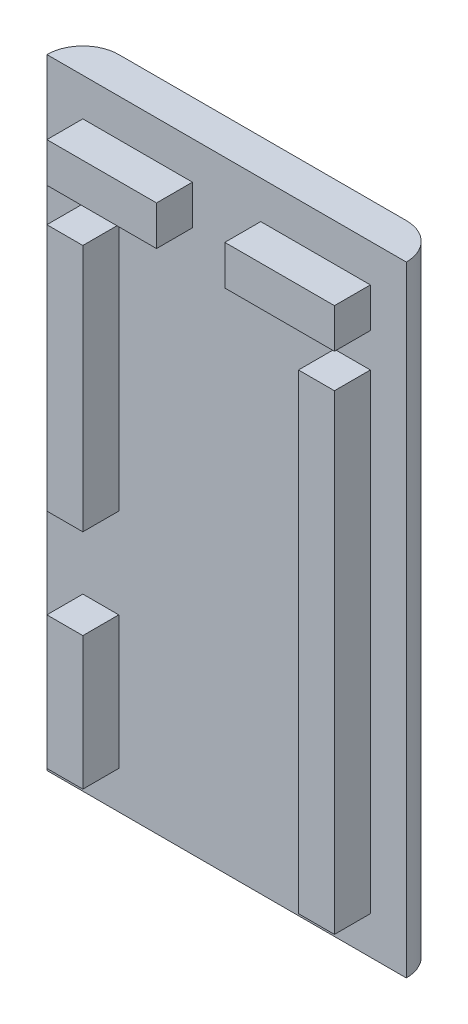
ISO-10303-21;
HEADER;
FILE_DESCRIPTION(('STEP AP214'),'2;1');
FILE_NAME('part.step','',(''),(''),'','','');
FILE_SCHEMA(('AUTOMOTIVE_DESIGN { 1 0 10303 214 1 1 1 1 }'));
ENDSEC;
DATA;
#1=APPLICATION_CONTEXT('core data for automotive mechanical design processes');
#2=APPLICATION_PROTOCOL_DEFINITION('international standard','automotive_design',2000,#1);
#3=PRODUCT_CONTEXT('',#1,'mechanical');
#4=PRODUCT('Part','Part','',(#3));
#5=PRODUCT_RELATED_PRODUCT_CATEGORY('part','',(#4));
#6=PRODUCT_DEFINITION_FORMATION('','',#4);
#7=PRODUCT_DEFINITION_CONTEXT('part definition',#1,'design');
#8=PRODUCT_DEFINITION('design','',#6,#7);
#9=PRODUCT_DEFINITION_SHAPE('','',#8);
#10=(LENGTH_UNIT() NAMED_UNIT(*) SI_UNIT(.MILLI.,.METRE.));
#11=(NAMED_UNIT(*) PLANE_ANGLE_UNIT() SI_UNIT($,.RADIAN.));
#12=(NAMED_UNIT(*) SI_UNIT($,.STERADIAN.) SOLID_ANGLE_UNIT());
#13=UNCERTAINTY_MEASURE_WITH_UNIT(LENGTH_MEASURE(1.E-05),#10,'distance_accuracy_value','');
#14=(GEOMETRIC_REPRESENTATION_CONTEXT(3) GLOBAL_UNCERTAINTY_ASSIGNED_CONTEXT((#13)) GLOBAL_UNIT_ASSIGNED_CONTEXT((#10,
#11,#12)) REPRESENTATION_CONTEXT('',''));
#15=CARTESIAN_POINT('',(0.,0.,0.));
#16=DIRECTION('',(0.,0.,1.));
#17=DIRECTION('',(1.,0.,0.));
#18=AXIS2_PLACEMENT_3D('',#15,#16,#17);
#19=CARTESIAN_POINT('',(-8.,12.95,4.));
#20=DIRECTION('',(0.,1.,0.));
#21=DIRECTION('',(0.,0.,1.));
#22=AXIS2_PLACEMENT_3D('',#19,#20,#21);
#23=PLANE('',#22);
#24=DIRECTION('',(0.,0.,-1.));
#25=VECTOR('',#24,1.);
#26=CARTESIAN_POINT('',(-1.9,12.95,4.));
#27=LINE('',#26,#25);
#28=CARTESIAN_POINT('',(-1.9,12.95,4.));
#29=VERTEX_POINT('',#28);
#30=CARTESIAN_POINT('',(-1.9,12.95,2.));
#31=VERTEX_POINT('',#30);
#32=EDGE_CURVE('E216',#29,#31,#27,.T.);
#33=ORIENTED_EDGE('',*,*,#32,.F.);
#34=DIRECTION('',(1.,0.,0.));
#35=VECTOR('',#34,1.);
#36=CARTESIAN_POINT('',(-8.,12.95,4.));
#37=LINE('',#36,#35);
#38=CARTESIAN_POINT('',(-8.,12.95,4.));
#39=VERTEX_POINT('',#38);
#40=EDGE_CURVE('E249',#39,#29,#37,.T.);
#41=ORIENTED_EDGE('',*,*,#40,.F.);
#42=DIRECTION('',(0.,0.,-1.));
#43=VECTOR('',#42,1.);
#44=CARTESIAN_POINT('',(-8.,12.95,4.));
#45=LINE('',#44,#43);
#46=CARTESIAN_POINT('',(-8.,12.95,2.));
#47=VERTEX_POINT('',#46);
#48=EDGE_CURVE('E226',#39,#47,#45,.T.);
#49=ORIENTED_EDGE('',*,*,#48,.T.);
#50=DIRECTION('',(1.,0.,0.));
#51=VECTOR('',#50,1.);
#52=CARTESIAN_POINT('',(-8.,12.95,2.));
#53=LINE('',#52,#51);
#54=EDGE_CURVE('E213',#47,#31,#53,.T.);
#55=ORIENTED_EDGE('',*,*,#54,.T.);
#56=EDGE_LOOP('',(#33,#41,#49,#55));
#57=FACE_BOUND('',#56,.T.);
#58=ADVANCED_FACE('F44',(#57),#23,.F.);
#59=CARTESIAN_POINT('',(-8.,15.15,4.));
#60=DIRECTION('',(0.,-1.,0.));
#61=DIRECTION('',(0.,0.,-1.));
#62=AXIS2_PLACEMENT_3D('',#59,#60,#61);
#63=PLANE('',#62);
#64=DIRECTION('',(0.,0.,1.));
#65=VECTOR('',#64,1.);
#66=CARTESIAN_POINT('',(-1.9,15.15,4.));
#67=LINE('',#66,#65);
#68=CARTESIAN_POINT('',(-1.9,15.15,2.));
#69=VERTEX_POINT('',#68);
#70=CARTESIAN_POINT('',(-1.9,15.15,4.));
#71=VERTEX_POINT('',#70);
#72=EDGE_CURVE('E60',#69,#71,#67,.T.);
#73=ORIENTED_EDGE('',*,*,#72,.F.);
#74=DIRECTION('',(-1.,0.,0.));
#75=VECTOR('',#74,1.);
#76=CARTESIAN_POINT('',(-8.,15.15,2.));
#77=LINE('',#76,#75);
#78=CARTESIAN_POINT('',(-8.,15.15,2.));
#79=VERTEX_POINT('',#78);
#80=EDGE_CURVE('E214',#69,#79,#77,.T.);
#81=ORIENTED_EDGE('',*,*,#80,.T.);
#82=DIRECTION('',(0.,0.,-1.));
#83=VECTOR('',#82,1.);
#84=CARTESIAN_POINT('',(-8.,15.15,4.));
#85=LINE('',#84,#83);
#86=CARTESIAN_POINT('',(-8.,15.15,4.));
#87=VERTEX_POINT('',#86);
#88=EDGE_CURVE('E441',#87,#79,#85,.T.);
#89=ORIENTED_EDGE('',*,*,#88,.F.);
#90=DIRECTION('',(-1.,0.,0.));
#91=VECTOR('',#90,1.);
#92=CARTESIAN_POINT('',(-8.,15.15,4.));
#93=LINE('',#92,#91);
#94=EDGE_CURVE('E245',#71,#87,#93,.T.);
#95=ORIENTED_EDGE('',*,*,#94,.F.);
#96=EDGE_LOOP('',(#73,#81,#89,#95));
#97=FACE_BOUND('',#96,.T.);
#98=ADVANCED_FACE('F403',(#97),#63,.F.);
#99=CARTESIAN_POINT('',(0.,0.,4.));
#100=DIRECTION('',(0.,0.,1.));
#101=DIRECTION('',(1.,0.,0.));
#102=AXIS2_PLACEMENT_3D('',#99,#100,#101);
#103=PLANE('',#102);
#104=ORIENTED_EDGE('',*,*,#40,.T.);
#105=DIRECTION('',(0.,-1.,0.));
#106=VECTOR('',#105,1.);
#107=CARTESIAN_POINT('',(-1.9,12.95,4.));
#108=LINE('',#107,#106);
#109=EDGE_CURVE('E220',#71,#29,#108,.T.);
#110=ORIENTED_EDGE('',*,*,#109,.F.);
#111=ORIENTED_EDGE('',*,*,#94,.T.);
#112=DIRECTION('',(0.,-1.,0.));
#113=VECTOR('',#112,1.);
#114=CARTESIAN_POINT('',(-8.,15.15,4.));
#115=LINE('',#114,#113);
#116=EDGE_CURVE('E252',#87,#39,#115,.T.);
#117=ORIENTED_EDGE('',*,*,#116,.T.);
#118=EDGE_LOOP('',(#104,#110,#111,#117));
#119=FACE_BOUND('',#118,.T.);
#120=ADVANCED_FACE('F410',(#119),#103,.T.);
#121=CARTESIAN_POINT('',(0.,0.,2.));
#122=DIRECTION('',(0.,0.,1.));
#123=DIRECTION('',(1.,0.,0.));
#124=AXIS2_PLACEMENT_3D('',#121,#122,#123);
#125=PLANE('',#124);
#126=DIRECTION('',(0.,1.,0.));
#127=VECTOR('',#126,1.);
#128=CARTESIAN_POINT('',(-1.9,12.95,2.));
#129=LINE('',#128,#127);
#130=EDGE_CURVE('E207',#31,#69,#129,.T.);
#131=ORIENTED_EDGE('',*,*,#130,.F.);
#132=ORIENTED_EDGE('',*,*,#54,.F.);
#133=DIRECTION('',(0.,-1.,0.));
#134=VECTOR('',#133,1.);
#135=CARTESIAN_POINT('',(-8.,15.15,2.));
#136=LINE('',#135,#134);
#137=EDGE_CURVE('E229',#79,#47,#136,.T.);
#138=ORIENTED_EDGE('',*,*,#137,.F.);
#139=ORIENTED_EDGE('',*,*,#80,.F.);
#140=EDGE_LOOP('',(#131,#132,#138,#139));
#141=FACE_BOUND('',#140,.T.);
#142=DIRECTION('',(-1.,0.,0.));
#143=VECTOR('',#142,1.);
#144=CARTESIAN_POINT('',(-10.,17.25,2.));
#145=LINE('',#144,#143);
#146=CARTESIAN_POINT('',(10.,17.25,2.));
#147=VERTEX_POINT('',#146);
#148=CARTESIAN_POINT('',(-10.,17.25,2.));
#149=VERTEX_POINT('',#148);
#150=EDGE_CURVE('E339',#147,#149,#145,.T.);
#151=ORIENTED_EDGE('',*,*,#150,.T.);
#152=DIRECTION('',(0.,-1.,0.));
#153=VECTOR('',#152,1.);
#154=CARTESIAN_POINT('',(-10.,-17.25,2.));
#155=LINE('',#154,#153);
#156=CARTESIAN_POINT('',(-10.,-17.25,2.));
#157=VERTEX_POINT('',#156);
#158=EDGE_CURVE('E343',#149,#157,#155,.T.);
#159=ORIENTED_EDGE('',*,*,#158,.T.);
#160=DIRECTION('',(1.,0.,0.));
#161=VECTOR('',#160,1.);
#162=CARTESIAN_POINT('',(-10.,-17.25,2.));
#163=LINE('',#162,#161);
#164=CARTESIAN_POINT('',(10.,-17.25,2.));
#165=VERTEX_POINT('',#164);
#166=EDGE_CURVE('E348',#157,#165,#163,.T.);
#167=ORIENTED_EDGE('',*,*,#166,.T.);
#168=DIRECTION('',(0.,1.,0.));
#169=VECTOR('',#168,1.);
#170=CARTESIAN_POINT('',(10.,-17.25,2.));
#171=LINE('',#170,#169);
#172=EDGE_CURVE('E352',#165,#147,#171,.T.);
#173=ORIENTED_EDGE('',*,*,#172,.T.);
#174=EDGE_LOOP('',(#151,#159,#167,#173));
#175=FACE_BOUND('',#174,.T.);
#176=DIRECTION('',(-1.,0.,0.));
#177=VECTOR('',#176,1.);
#178=CARTESIAN_POINT('',(6.,11.05,2.));
#179=LINE('',#178,#177);
#180=CARTESIAN_POINT('',(8.,11.05,2.));
#181=VERTEX_POINT('',#180);
#182=CARTESIAN_POINT('',(6.,11.05,2.));
#183=VERTEX_POINT('',#182);
#184=EDGE_CURVE('E316',#181,#183,#179,.T.);
#185=ORIENTED_EDGE('',*,*,#184,.F.);
#186=DIRECTION('',(0.,1.,0.));
#187=VECTOR('',#186,1.);
#188=CARTESIAN_POINT('',(8.,11.05,2.));
#189=LINE('',#188,#187);
#190=CARTESIAN_POINT('',(8.,-15.15,2.));
#191=VERTEX_POINT('',#190);
#192=EDGE_CURVE('E234',#191,#181,#189,.T.);
#193=ORIENTED_EDGE('',*,*,#192,.F.);
#194=DIRECTION('',(1.,0.,0.));
#195=VECTOR('',#194,1.);
#196=CARTESIAN_POINT('',(6.,-15.15,2.));
#197=LINE('',#196,#195);
#198=CARTESIAN_POINT('',(6.,-15.15,2.));
#199=VERTEX_POINT('',#198);
#200=EDGE_CURVE('E303',#199,#191,#197,.T.);
#201=ORIENTED_EDGE('',*,*,#200,.F.);
#202=DIRECTION('',(0.,-1.,0.));
#203=VECTOR('',#202,1.);
#204=CARTESIAN_POINT('',(6.,-15.15,2.));
#205=LINE('',#204,#203);
#206=EDGE_CURVE('E319',#183,#199,#205,.T.);
#207=ORIENTED_EDGE('',*,*,#206,.F.);
#208=EDGE_LOOP('',(#185,#193,#201,#207));
#209=FACE_BOUND('',#208,.T.);
#210=DIRECTION('',(-1.,0.,0.));
#211=VECTOR('',#210,1.);
#212=CARTESIAN_POINT('',(-6.,11.05,2.));
#213=LINE('',#212,#211);
#214=CARTESIAN_POINT('',(-6.,11.05,2.));
#215=VERTEX_POINT('',#214);
#216=CARTESIAN_POINT('',(-8.,11.05,2.));
#217=VERTEX_POINT('',#216);
#218=EDGE_CURVE('E453',#215,#217,#213,.T.);
#219=ORIENTED_EDGE('',*,*,#218,.F.);
#220=DIRECTION('',(0.,1.,0.));
#221=VECTOR('',#220,1.);
#222=CARTESIAN_POINT('',(-6.,-2.75,2.));
#223=LINE('',#222,#221);
#224=CARTESIAN_POINT('',(-6.,-2.75,2.));
#225=VERTEX_POINT('',#224);
#226=EDGE_CURVE('E260',#225,#215,#223,.T.);
#227=ORIENTED_EDGE('',*,*,#226,.F.);
#228=DIRECTION('',(1.,0.,0.));
#229=VECTOR('',#228,1.);
#230=CARTESIAN_POINT('',(-8.,-2.75,2.));
#231=LINE('',#230,#229);
#232=CARTESIAN_POINT('',(-8.,-2.75,2.));
#233=VERTEX_POINT('',#232);
#234=EDGE_CURVE('E460',#233,#225,#231,.T.);
#235=ORIENTED_EDGE('',*,*,#234,.F.);
#236=DIRECTION('',(0.,-1.,0.));
#237=VECTOR('',#236,1.);
#238=CARTESIAN_POINT('',(-8.,11.05,2.));
#239=LINE('',#238,#237);
#240=EDGE_CURVE('E456',#217,#233,#239,.T.);
#241=ORIENTED_EDGE('',*,*,#240,.F.);
#242=EDGE_LOOP('',(#219,#227,#235,#241));
#243=FACE_BOUND('',#242,.T.);
#244=DIRECTION('',(1.,0.,0.));
#245=VECTOR('',#244,1.);
#246=CARTESIAN_POINT('',(-8.,-15.15,2.));
#247=LINE('',#246,#245);
#248=CARTESIAN_POINT('',(-8.,-15.15,2.));
#249=VERTEX_POINT('',#248);
#250=CARTESIAN_POINT('',(-6.,-15.15,2.));
#251=VERTEX_POINT('',#250);
#252=EDGE_CURVE('E280',#249,#251,#247,.T.);
#253=ORIENTED_EDGE('',*,*,#252,.F.);
#254=DIRECTION('',(0.,-1.,0.));
#255=VECTOR('',#254,1.);
#256=CARTESIAN_POINT('',(-8.,-7.75,2.));
#257=LINE('',#256,#255);
#258=CARTESIAN_POINT('',(-8.,-7.75,2.));
#259=VERTEX_POINT('',#258);
#260=EDGE_CURVE('E283',#259,#249,#257,.T.);
#261=ORIENTED_EDGE('',*,*,#260,.F.);
#262=DIRECTION('',(-1.,0.,0.));
#263=VECTOR('',#262,1.);
#264=CARTESIAN_POINT('',(-8.,-7.75,2.));
#265=LINE('',#264,#263);
#266=CARTESIAN_POINT('',(-6.,-7.75,2.));
#267=VERTEX_POINT('',#266);
#268=EDGE_CURVE('E272',#267,#259,#265,.T.);
#269=ORIENTED_EDGE('',*,*,#268,.F.);
#270=DIRECTION('',(0.,1.,0.));
#271=VECTOR('',#270,1.);
#272=CARTESIAN_POINT('',(-6.,-15.15,2.));
#273=LINE('',#272,#271);
#274=EDGE_CURVE('E275',#251,#267,#273,.T.);
#275=ORIENTED_EDGE('',*,*,#274,.F.);
#276=EDGE_LOOP('',(#253,#261,#269,#275));
#277=FACE_BOUND('',#276,.T.);
#278=CARTESIAN_POINT('',(1.9,12.95,2.));
#279=VERTEX_POINT('',#278);
#280=CARTESIAN_POINT('',(8.,12.95,2.));
#281=VERTEX_POINT('',#280);
#282=EDGE_CURVE('E230',#279,#281,#53,.T.);
#283=ORIENTED_EDGE('',*,*,#282,.F.);
#284=DIRECTION('',(0.,1.,0.));
#285=VECTOR('',#284,1.);
#286=CARTESIAN_POINT('',(1.9,12.95,2.));
#287=LINE('',#286,#285);
#288=CARTESIAN_POINT('',(1.9,15.15,2.));
#289=VERTEX_POINT('',#288);
#290=EDGE_CURVE('E497',#279,#289,#287,.T.);
#291=ORIENTED_EDGE('',*,*,#290,.T.);
#292=CARTESIAN_POINT('',(8.,15.15,2.));
#293=VERTEX_POINT('',#292);
#294=EDGE_CURVE('E506',#293,#289,#77,.T.);
#295=ORIENTED_EDGE('',*,*,#294,.F.);
#296=DIRECTION('',(0.,1.,0.));
#297=VECTOR('',#296,1.);
#298=CARTESIAN_POINT('',(8.,15.15,2.));
#299=LINE('',#298,#297);
#300=EDGE_CURVE('E236',#281,#293,#299,.T.);
#301=ORIENTED_EDGE('',*,*,#300,.F.);
#302=EDGE_LOOP('',(#283,#291,#295,#301));
#303=FACE_BOUND('',#302,.T.);
#304=ADVANCED_FACE('F209',(#141,#175,#209,#243,#277,#303),#125,.T.);
#305=CARTESIAN_POINT('',(-10.,17.25,2.));
#306=DIRECTION('',(0.,-1.,0.));
#307=DIRECTION('',(0.,0.,-1.));
#308=AXIS2_PLACEMENT_3D('',#305,#306,#307);
#309=PLANE('',#308);
#310=DIRECTION('',(-1.,0.,0.));
#311=VECTOR('',#310,1.);
#312=CARTESIAN_POINT('',(-10.,17.25,0.));
#313=LINE('',#312,#311);
#314=CARTESIAN_POINT('',(8.,17.25,0.));
#315=VERTEX_POINT('',#314);
#316=CARTESIAN_POINT('',(-8.,17.25,0.));
#317=VERTEX_POINT('',#316);
#318=EDGE_CURVE('E338',#315,#317,#313,.T.);
#319=ORIENTED_EDGE('',*,*,#318,.T.);
#320=CARTESIAN_POINT('',(-8.,17.25,2.));
#321=DIRECTION('',(0.,-1.,0.));
#322=DIRECTION('',(0.,0.,-1.));
#323=AXIS2_PLACEMENT_3D('',#320,#321,#322);
#324=CIRCLE('',#323,2.);
#325=EDGE_CURVE('E11',#317,#149,#324,.F.);
#326=ORIENTED_EDGE('',*,*,#325,.T.);
#327=ORIENTED_EDGE('',*,*,#150,.F.);
#328=CARTESIAN_POINT('',(8.,17.25,2.));
#329=DIRECTION('',(0.,-1.,0.));
#330=DIRECTION('',(0.,0.,-1.));
#331=AXIS2_PLACEMENT_3D('',#328,#329,#330);
#332=CIRCLE('',#331,2.);
#333=EDGE_CURVE('E53',#147,#315,#332,.F.);
#334=ORIENTED_EDGE('',*,*,#333,.T.);
#335=EDGE_LOOP('',(#319,#326,#327,#334));
#336=FACE_BOUND('',#335,.T.);
#337=ADVANCED_FACE('F377',(#336),#309,.F.);
#338=CARTESIAN_POINT('',(-10.,-17.25,2.));
#339=DIRECTION('',(0.,1.,0.));
#340=DIRECTION('',(0.,0.,1.));
#341=AXIS2_PLACEMENT_3D('',#338,#339,#340);
#342=PLANE('',#341);
#343=ORIENTED_EDGE('',*,*,#166,.F.);
#344=CARTESIAN_POINT('',(-8.,-17.25,2.));
#345=DIRECTION('',(0.,1.,0.));
#346=DIRECTION('',(0.,0.,1.));
#347=AXIS2_PLACEMENT_3D('',#344,#345,#346);
#348=CIRCLE('',#347,2.);
#349=CARTESIAN_POINT('',(-8.,-17.25,0.));
#350=VERTEX_POINT('',#349);
#351=EDGE_CURVE('E365',#157,#350,#348,.F.);
#352=ORIENTED_EDGE('',*,*,#351,.T.);
#353=DIRECTION('',(1.,0.,0.));
#354=VECTOR('',#353,1.);
#355=CARTESIAN_POINT('',(-10.,-17.25,0.));
#356=LINE('',#355,#354);
#357=CARTESIAN_POINT('',(8.,-17.25,0.));
#358=VERTEX_POINT('',#357);
#359=EDGE_CURVE('E344',#350,#358,#356,.T.);
#360=ORIENTED_EDGE('',*,*,#359,.T.);
#361=CARTESIAN_POINT('',(8.,-17.25,2.));
#362=DIRECTION('',(0.,1.,0.));
#363=DIRECTION('',(0.,0.,1.));
#364=AXIS2_PLACEMENT_3D('',#361,#362,#363);
#365=CIRCLE('',#364,2.);
#366=EDGE_CURVE('E356',#358,#165,#365,.F.);
#367=ORIENTED_EDGE('',*,*,#366,.T.);
#368=EDGE_LOOP('',(#343,#352,#360,#367));
#369=FACE_BOUND('',#368,.T.);
#370=ADVANCED_FACE('F389',(#369),#342,.F.);
#371=CARTESIAN_POINT('',(0.,0.,0.));
#372=DIRECTION('',(0.,0.,1.));
#373=DIRECTION('',(1.,0.,0.));
#374=AXIS2_PLACEMENT_3D('',#371,#372,#373);
#375=PLANE('',#374);
#376=ORIENTED_EDGE('',*,*,#359,.F.);
#377=DIRECTION('',(0.,-1.,0.));
#378=VECTOR('',#377,1.);
#379=CARTESIAN_POINT('',(-8.,0.,0.));
#380=LINE('',#379,#378);
#381=EDGE_CURVE('E371',#350,#317,#380,.F.);
#382=ORIENTED_EDGE('',*,*,#381,.T.);
#383=ORIENTED_EDGE('',*,*,#318,.F.);
#384=DIRECTION('',(0.,1.,0.));
#385=VECTOR('',#384,1.);
#386=CARTESIAN_POINT('',(8.,0.,0.));
#387=LINE('',#386,#385);
#388=EDGE_CURVE('E368',#315,#358,#387,.F.);
#389=ORIENTED_EDGE('',*,*,#388,.T.);
#390=EDGE_LOOP('',(#376,#382,#383,#389));
#391=FACE_BOUND('',#390,.T.);
#392=ADVANCED_FACE('F384',(#391),#375,.F.);
#393=CARTESIAN_POINT('',(-8.,-17.25,2.));
#394=DIRECTION('',(0.,-1.,0.));
#395=DIRECTION('',(0.,0.,-1.));
#396=AXIS2_PLACEMENT_3D('',#393,#394,#395);
#397=CYLINDRICAL_SURFACE('',#396,2.);
#398=ORIENTED_EDGE('',*,*,#325,.F.);
#399=ORIENTED_EDGE('',*,*,#381,.F.);
#400=ORIENTED_EDGE('',*,*,#351,.F.);
#401=ORIENTED_EDGE('',*,*,#158,.F.);
#402=EDGE_LOOP('',(#398,#399,#400,#401));
#403=FACE_BOUND('',#402,.T.);
#404=ADVANCED_FACE('F393',(#403),#397,.T.);
#405=CARTESIAN_POINT('',(8.,-17.25,2.));
#406=DIRECTION('',(0.,1.,0.));
#407=DIRECTION('',(0.,0.,1.));
#408=AXIS2_PLACEMENT_3D('',#405,#406,#407);
#409=CYLINDRICAL_SURFACE('',#408,2.);
#410=ORIENTED_EDGE('',*,*,#366,.F.);
#411=ORIENTED_EDGE('',*,*,#388,.F.);
#412=ORIENTED_EDGE('',*,*,#333,.F.);
#413=ORIENTED_EDGE('',*,*,#172,.F.);
#414=EDGE_LOOP('',(#410,#411,#412,#413));
#415=FACE_BOUND('',#414,.T.);
#416=ADVANCED_FACE('F46',(#415),#409,.T.);
#417=CARTESIAN_POINT('',(8.,11.05,4.));
#418=DIRECTION('',(-1.,0.,0.));
#419=DIRECTION('',(0.,0.,1.));
#420=AXIS2_PLACEMENT_3D('',#417,#418,#419);
#421=PLANE('',#420);
#422=ORIENTED_EDGE('',*,*,#192,.T.);
#423=DIRECTION('',(0.,0.,-1.));
#424=VECTOR('',#423,1.);
#425=CARTESIAN_POINT('',(8.,11.05,4.));
#426=LINE('',#425,#424);
#427=CARTESIAN_POINT('',(8.,11.05,4.));
#428=VERTEX_POINT('',#427);
#429=EDGE_CURVE('E335',#428,#181,#426,.T.);
#430=ORIENTED_EDGE('',*,*,#429,.F.);
#431=DIRECTION('',(0.,1.,0.));
#432=VECTOR('',#431,1.);
#433=CARTESIAN_POINT('',(8.,11.05,4.));
#434=LINE('',#433,#432);
#435=CARTESIAN_POINT('',(8.,-15.15,4.));
#436=VERTEX_POINT('',#435);
#437=EDGE_CURVE('E298',#436,#428,#434,.T.);
#438=ORIENTED_EDGE('',*,*,#437,.F.);
#439=DIRECTION('',(0.,0.,-1.));
#440=VECTOR('',#439,1.);
#441=CARTESIAN_POINT('',(8.,-15.15,4.));
#442=LINE('',#441,#440);
#443=EDGE_CURVE('E312',#436,#191,#442,.T.);
#444=ORIENTED_EDGE('',*,*,#443,.T.);
#445=EDGE_LOOP('',(#422,#430,#438,#444));
#446=FACE_BOUND('',#445,.T.);
#447=ADVANCED_FACE('F399',(#446),#421,.F.);
#448=CARTESIAN_POINT('',(6.,11.05,4.));
#449=DIRECTION('',(0.,-1.,0.));
#450=DIRECTION('',(0.,0.,-1.));
#451=AXIS2_PLACEMENT_3D('',#448,#449,#450);
#452=PLANE('',#451);
#453=ORIENTED_EDGE('',*,*,#184,.T.);
#454=DIRECTION('',(0.,0.,-1.));
#455=VECTOR('',#454,1.);
#456=CARTESIAN_POINT('',(6.,11.05,4.));
#457=LINE('',#456,#455);
#458=CARTESIAN_POINT('',(6.,11.05,4.));
#459=VERTEX_POINT('',#458);
#460=EDGE_CURVE('E331',#459,#183,#457,.T.);
#461=ORIENTED_EDGE('',*,*,#460,.F.);
#462=DIRECTION('',(-1.,0.,0.));
#463=VECTOR('',#462,1.);
#464=CARTESIAN_POINT('',(6.,11.05,4.));
#465=LINE('',#464,#463);
#466=EDGE_CURVE('E302',#428,#459,#465,.T.);
#467=ORIENTED_EDGE('',*,*,#466,.F.);
#468=ORIENTED_EDGE('',*,*,#429,.T.);
#469=EDGE_LOOP('',(#453,#461,#467,#468));
#470=FACE_BOUND('',#469,.T.);
#471=ADVANCED_FACE('F660',(#470),#452,.F.);
#472=CARTESIAN_POINT('',(6.,-15.15,4.));
#473=DIRECTION('',(1.,0.,0.));
#474=DIRECTION('',(0.,0.,-1.));
#475=AXIS2_PLACEMENT_3D('',#472,#473,#474);
#476=PLANE('',#475);
#477=ORIENTED_EDGE('',*,*,#206,.T.);
#478=DIRECTION('',(0.,0.,-1.));
#479=VECTOR('',#478,1.);
#480=CARTESIAN_POINT('',(6.,-15.15,4.));
#481=LINE('',#480,#479);
#482=CARTESIAN_POINT('',(6.,-15.15,4.));
#483=VERTEX_POINT('',#482);
#484=EDGE_CURVE('E328',#483,#199,#481,.T.);
#485=ORIENTED_EDGE('',*,*,#484,.F.);
#486=DIRECTION('',(0.,-1.,0.));
#487=VECTOR('',#486,1.);
#488=CARTESIAN_POINT('',(6.,-15.15,4.));
#489=LINE('',#488,#487);
#490=EDGE_CURVE('E306',#459,#483,#489,.T.);
#491=ORIENTED_EDGE('',*,*,#490,.F.);
#492=ORIENTED_EDGE('',*,*,#460,.T.);
#493=EDGE_LOOP('',(#477,#485,#491,#492));
#494=FACE_BOUND('',#493,.T.);
#495=ADVANCED_FACE('F656',(#494),#476,.F.);
#496=CARTESIAN_POINT('',(6.,-15.15,4.));
#497=DIRECTION('',(0.,1.,0.));
#498=DIRECTION('',(0.,0.,1.));
#499=AXIS2_PLACEMENT_3D('',#496,#497,#498);
#500=PLANE('',#499);
#501=ORIENTED_EDGE('',*,*,#200,.T.);
#502=ORIENTED_EDGE('',*,*,#443,.F.);
#503=DIRECTION('',(1.,0.,0.));
#504=VECTOR('',#503,1.);
#505=CARTESIAN_POINT('',(6.,-15.15,4.));
#506=LINE('',#505,#504);
#507=EDGE_CURVE('E309',#483,#436,#506,.T.);
#508=ORIENTED_EDGE('',*,*,#507,.F.);
#509=ORIENTED_EDGE('',*,*,#484,.T.);
#510=EDGE_LOOP('',(#501,#502,#508,#509));
#511=FACE_BOUND('',#510,.T.);
#512=ADVANCED_FACE('F652',(#511),#500,.F.);
#513=CARTESIAN_POINT('',(0.,0.,4.));
#514=DIRECTION('',(0.,0.,1.));
#515=DIRECTION('',(1.,0.,0.));
#516=AXIS2_PLACEMENT_3D('',#513,#514,#515);
#517=PLANE('',#516);
#518=ORIENTED_EDGE('',*,*,#437,.T.);
#519=ORIENTED_EDGE('',*,*,#466,.T.);
#520=ORIENTED_EDGE('',*,*,#490,.T.);
#521=ORIENTED_EDGE('',*,*,#507,.T.);
#522=EDGE_LOOP('',(#518,#519,#520,#521));
#523=FACE_BOUND('',#522,.T.);
#524=ADVANCED_FACE('F588',(#523),#517,.T.);
#525=CARTESIAN_POINT('',(-6.,-2.75,4.));
#526=DIRECTION('',(-1.,0.,0.));
#527=DIRECTION('',(0.,0.,1.));
#528=AXIS2_PLACEMENT_3D('',#525,#526,#527);
#529=PLANE('',#528);
#530=ORIENTED_EDGE('',*,*,#226,.T.);
#531=DIRECTION('',(0.,0.,-1.));
#532=VECTOR('',#531,1.);
#533=CARTESIAN_POINT('',(-6.,11.05,4.));
#534=LINE('',#533,#532);
#535=CARTESIAN_POINT('',(-6.,11.05,4.));
#536=VERTEX_POINT('',#535);
#537=EDGE_CURVE('E487',#536,#215,#534,.T.);
#538=ORIENTED_EDGE('',*,*,#537,.F.);
#539=DIRECTION('',(0.,1.,0.));
#540=VECTOR('',#539,1.);
#541=CARTESIAN_POINT('',(-6.,-2.75,4.));
#542=LINE('',#541,#540);
#543=CARTESIAN_POINT('',(-6.,-2.75,4.));
#544=VERTEX_POINT('',#543);
#545=EDGE_CURVE('E463',#544,#536,#542,.T.);
#546=ORIENTED_EDGE('',*,*,#545,.F.);
#547=DIRECTION('',(0.,0.,-1.));
#548=VECTOR('',#547,1.);
#549=CARTESIAN_POINT('',(-6.,-2.75,4.));
#550=LINE('',#549,#548);
#551=EDGE_CURVE('E476',#544,#225,#550,.T.);
#552=ORIENTED_EDGE('',*,*,#551,.T.);
#553=EDGE_LOOP('',(#530,#538,#546,#552));
#554=FACE_BOUND('',#553,.T.);
#555=ADVANCED_FACE('F584',(#554),#529,.F.);
#556=CARTESIAN_POINT('',(-6.,11.05,4.));
#557=DIRECTION('',(0.,-1.,0.));
#558=DIRECTION('',(0.,0.,-1.));
#559=AXIS2_PLACEMENT_3D('',#556,#557,#558);
#560=PLANE('',#559);
#561=ORIENTED_EDGE('',*,*,#218,.T.);
#562=DIRECTION('',(0.,0.,-1.));
#563=VECTOR('',#562,1.);
#564=CARTESIAN_POINT('',(-8.,11.05,4.));
#565=LINE('',#564,#563);
#566=CARTESIAN_POINT('',(-8.,11.05,4.));
#567=VERTEX_POINT('',#566);
#568=EDGE_CURVE('E483',#567,#217,#565,.T.);
#569=ORIENTED_EDGE('',*,*,#568,.F.);
#570=DIRECTION('',(-1.,0.,0.));
#571=VECTOR('',#570,1.);
#572=CARTESIAN_POINT('',(-6.,11.05,4.));
#573=LINE('',#572,#571);
#574=EDGE_CURVE('E467',#536,#567,#573,.T.);
#575=ORIENTED_EDGE('',*,*,#574,.F.);
#576=ORIENTED_EDGE('',*,*,#537,.T.);
#577=EDGE_LOOP('',(#561,#569,#575,#576));
#578=FACE_BOUND('',#577,.T.);
#579=ADVANCED_FACE('F587',(#578),#560,.F.);
#580=CARTESIAN_POINT('',(-8.,11.05,4.));
#581=DIRECTION('',(1.,0.,0.));
#582=DIRECTION('',(0.,0.,-1.));
#583=AXIS2_PLACEMENT_3D('',#580,#581,#582);
#584=PLANE('',#583);
#585=ORIENTED_EDGE('',*,*,#240,.T.);
#586=DIRECTION('',(0.,0.,-1.));
#587=VECTOR('',#586,1.);
#588=CARTESIAN_POINT('',(-8.,-2.75,4.));
#589=LINE('',#588,#587);
#590=CARTESIAN_POINT('',(-8.,-2.75,4.));
#591=VERTEX_POINT('',#590);
#592=EDGE_CURVE('E480',#591,#233,#589,.T.);
#593=ORIENTED_EDGE('',*,*,#592,.F.);
#594=DIRECTION('',(0.,-1.,0.));
#595=VECTOR('',#594,1.);
#596=CARTESIAN_POINT('',(-8.,11.05,4.));
#597=LINE('',#596,#595);
#598=EDGE_CURVE('E470',#567,#591,#597,.T.);
#599=ORIENTED_EDGE('',*,*,#598,.F.);
#600=ORIENTED_EDGE('',*,*,#568,.T.);
#601=EDGE_LOOP('',(#585,#593,#599,#600));
#602=FACE_BOUND('',#601,.T.);
#603=ADVANCED_FACE('F592',(#602),#584,.F.);
#604=CARTESIAN_POINT('',(-8.,-2.75,4.));
#605=DIRECTION('',(0.,1.,0.));
#606=DIRECTION('',(0.,0.,1.));
#607=AXIS2_PLACEMENT_3D('',#604,#605,#606);
#608=PLANE('',#607);
#609=ORIENTED_EDGE('',*,*,#234,.T.);
#610=ORIENTED_EDGE('',*,*,#551,.F.);
#611=DIRECTION('',(1.,0.,0.));
#612=VECTOR('',#611,1.);
#613=CARTESIAN_POINT('',(-8.,-2.75,4.));
#614=LINE('',#613,#612);
#615=EDGE_CURVE('E473',#591,#544,#614,.T.);
#616=ORIENTED_EDGE('',*,*,#615,.F.);
#617=ORIENTED_EDGE('',*,*,#592,.T.);
#618=EDGE_LOOP('',(#609,#610,#616,#617));
#619=FACE_BOUND('',#618,.T.);
#620=ADVANCED_FACE('F596',(#619),#608,.F.);
#621=CARTESIAN_POINT('',(0.,0.,4.));
#622=DIRECTION('',(0.,0.,1.));
#623=DIRECTION('',(1.,0.,0.));
#624=AXIS2_PLACEMENT_3D('',#621,#622,#623);
#625=PLANE('',#624);
#626=ORIENTED_EDGE('',*,*,#545,.T.);
#627=ORIENTED_EDGE('',*,*,#574,.T.);
#628=ORIENTED_EDGE('',*,*,#598,.T.);
#629=ORIENTED_EDGE('',*,*,#615,.T.);
#630=EDGE_LOOP('',(#626,#627,#628,#629));
#631=FACE_BOUND('',#630,.T.);
#632=ADVANCED_FACE('F600',(#631),#625,.T.);
#633=CARTESIAN_POINT('',(-8.,-7.75,4.));
#634=DIRECTION('',(1.,0.,0.));
#635=DIRECTION('',(0.,0.,-1.));
#636=AXIS2_PLACEMENT_3D('',#633,#634,#635);
#637=PLANE('',#636);
#638=ORIENTED_EDGE('',*,*,#260,.T.);
#639=DIRECTION('',(0.,0.,-1.));
#640=VECTOR('',#639,1.);
#641=CARTESIAN_POINT('',(-8.,-15.15,4.));
#642=LINE('',#641,#640);
#643=CARTESIAN_POINT('',(-8.,-15.15,4.));
#644=VERTEX_POINT('',#643);
#645=EDGE_CURVE('E256',#644,#249,#642,.T.);
#646=ORIENTED_EDGE('',*,*,#645,.F.);
#647=DIRECTION('',(0.,-1.,0.));
#648=VECTOR('',#647,1.);
#649=CARTESIAN_POINT('',(-8.,-7.75,4.));
#650=LINE('',#649,#648);
#651=CARTESIAN_POINT('',(-8.,-7.75,4.));
#652=VERTEX_POINT('',#651);
#653=EDGE_CURVE('E276',#652,#644,#650,.T.);
#654=ORIENTED_EDGE('',*,*,#653,.F.);
#655=DIRECTION('',(0.,0.,-1.));
#656=VECTOR('',#655,1.);
#657=CARTESIAN_POINT('',(-8.,-7.75,4.));
#658=LINE('',#657,#656);
#659=EDGE_CURVE('E267',#652,#259,#658,.T.);
#660=ORIENTED_EDGE('',*,*,#659,.T.);
#661=EDGE_LOOP('',(#638,#646,#654,#660));
#662=FACE_BOUND('',#661,.T.);
#663=ADVANCED_FACE('F603',(#662),#637,.F.);
#664=CARTESIAN_POINT('',(-8.,-15.15,4.));
#665=DIRECTION('',(0.,1.,0.));
#666=DIRECTION('',(0.,0.,1.));
#667=AXIS2_PLACEMENT_3D('',#664,#665,#666);
#668=PLANE('',#667);
#669=ORIENTED_EDGE('',*,*,#252,.T.);
#670=DIRECTION('',(0.,0.,-1.));
#671=VECTOR('',#670,1.);
#672=CARTESIAN_POINT('',(-6.,-15.15,4.));
#673=LINE('',#672,#671);
#674=CARTESIAN_POINT('',(-6.,-15.15,4.));
#675=VERTEX_POINT('',#674);
#676=EDGE_CURVE('E259',#675,#251,#673,.T.);
#677=ORIENTED_EDGE('',*,*,#676,.F.);
#678=DIRECTION('',(1.,0.,0.));
#679=VECTOR('',#678,1.);
#680=CARTESIAN_POINT('',(-8.,-15.15,4.));
#681=LINE('',#680,#679);
#682=EDGE_CURVE('E292',#644,#675,#681,.T.);
#683=ORIENTED_EDGE('',*,*,#682,.F.);
#684=ORIENTED_EDGE('',*,*,#645,.T.);
#685=EDGE_LOOP('',(#669,#677,#683,#684));
#686=FACE_BOUND('',#685,.T.);
#687=ADVANCED_FACE('F608',(#686),#668,.F.);
#688=CARTESIAN_POINT('',(-6.,-15.15,4.));
#689=DIRECTION('',(-1.,0.,0.));
#690=DIRECTION('',(0.,0.,1.));
#691=AXIS2_PLACEMENT_3D('',#688,#689,#690);
#692=PLANE('',#691);
#693=ORIENTED_EDGE('',*,*,#274,.T.);
#694=DIRECTION('',(0.,0.,-1.));
#695=VECTOR('',#694,1.);
#696=CARTESIAN_POINT('',(-6.,-7.75,4.));
#697=LINE('',#696,#695);
#698=CARTESIAN_POINT('',(-6.,-7.75,4.));
#699=VERTEX_POINT('',#698);
#700=EDGE_CURVE('E264',#699,#267,#697,.T.);
#701=ORIENTED_EDGE('',*,*,#700,.F.);
#702=DIRECTION('',(0.,1.,0.));
#703=VECTOR('',#702,1.);
#704=CARTESIAN_POINT('',(-6.,-15.15,4.));
#705=LINE('',#704,#703);
#706=EDGE_CURVE('E289',#675,#699,#705,.T.);
#707=ORIENTED_EDGE('',*,*,#706,.F.);
#708=ORIENTED_EDGE('',*,*,#676,.T.);
#709=EDGE_LOOP('',(#693,#701,#707,#708));
#710=FACE_BOUND('',#709,.T.);
#711=ADVANCED_FACE('F632',(#710),#692,.F.);
#712=CARTESIAN_POINT('',(-8.,-7.75,4.));
#713=DIRECTION('',(0.,-1.,0.));
#714=DIRECTION('',(1.,0.,0.));
#715=AXIS2_PLACEMENT_3D('',#712,#713,#714);
#716=PLANE('',#715);
#717=ORIENTED_EDGE('',*,*,#268,.T.);
#718=ORIENTED_EDGE('',*,*,#659,.F.);
#719=DIRECTION('',(-1.,0.,0.));
#720=VECTOR('',#719,1.);
#721=CARTESIAN_POINT('',(-8.,-7.75,4.));
#722=LINE('',#721,#720);
#723=EDGE_CURVE('E271',#699,#652,#722,.T.);
#724=ORIENTED_EDGE('',*,*,#723,.F.);
#725=ORIENTED_EDGE('',*,*,#700,.T.);
#726=EDGE_LOOP('',(#717,#718,#724,#725));
#727=FACE_BOUND('',#726,.T.);
#728=ADVANCED_FACE('F639',(#727),#716,.F.);
#729=CARTESIAN_POINT('',(0.,0.,4.));
#730=DIRECTION('',(0.,0.,1.));
#731=DIRECTION('',(1.,0.,0.));
#732=AXIS2_PLACEMENT_3D('',#729,#730,#731);
#733=PLANE('',#732);
#734=ORIENTED_EDGE('',*,*,#653,.T.);
#735=ORIENTED_EDGE('',*,*,#682,.T.);
#736=ORIENTED_EDGE('',*,*,#706,.T.);
#737=ORIENTED_EDGE('',*,*,#723,.T.);
#738=EDGE_LOOP('',(#734,#735,#736,#737));
#739=FACE_BOUND('',#738,.T.);
#740=ADVANCED_FACE('F426',(#739),#733,.T.);
#741=CARTESIAN_POINT('',(-8.,15.15,4.));
#742=DIRECTION('',(1.,0.,0.));
#743=DIRECTION('',(0.,0.,-1.));
#744=AXIS2_PLACEMENT_3D('',#741,#742,#743);
#745=PLANE('',#744);
#746=ORIENTED_EDGE('',*,*,#137,.T.);
#747=ORIENTED_EDGE('',*,*,#48,.F.);
#748=ORIENTED_EDGE('',*,*,#116,.F.);
#749=ORIENTED_EDGE('',*,*,#88,.T.);
#750=EDGE_LOOP('',(#746,#747,#748,#749));
#751=FACE_BOUND('',#750,.T.);
#752=ADVANCED_FACE('F418',(#751),#745,.F.);
#753=CARTESIAN_POINT('',(1.9,12.95,4.));
#754=VERTEX_POINT('',#753);
#755=CARTESIAN_POINT('',(8.,12.95,4.));
#756=VERTEX_POINT('',#755);
#757=EDGE_CURVE('E248',#754,#756,#37,.T.);
#758=ORIENTED_EDGE('',*,*,#757,.F.);
#759=DIRECTION('',(0.,0.,-1.));
#760=VECTOR('',#759,1.);
#761=CARTESIAN_POINT('',(1.9,12.95,4.));
#762=LINE('',#761,#760);
#763=EDGE_CURVE('E431',#754,#279,#762,.T.);
#764=ORIENTED_EDGE('',*,*,#763,.T.);
#765=ORIENTED_EDGE('',*,*,#282,.T.);
#766=DIRECTION('',(0.,0.,-1.));
#767=VECTOR('',#766,1.);
#768=CARTESIAN_POINT('',(8.,12.95,4.));
#769=LINE('',#768,#767);
#770=EDGE_CURVE('E434',#756,#281,#769,.T.);
#771=ORIENTED_EDGE('',*,*,#770,.F.);
#772=EDGE_LOOP('',(#758,#764,#765,#771));
#773=FACE_BOUND('',#772,.T.);
#774=ADVANCED_FACE('F405',(#773),#23,.F.);
#775=CARTESIAN_POINT('',(8.,15.15,4.));
#776=DIRECTION('',(-1.,0.,0.));
#777=DIRECTION('',(0.,-1.,0.));
#778=AXIS2_PLACEMENT_3D('',#775,#776,#777);
#779=PLANE('',#778);
#780=ORIENTED_EDGE('',*,*,#300,.T.);
#781=DIRECTION('',(0.,0.,-1.));
#782=VECTOR('',#781,1.);
#783=CARTESIAN_POINT('',(8.,15.15,4.));
#784=LINE('',#783,#782);
#785=CARTESIAN_POINT('',(8.,15.15,4.));
#786=VERTEX_POINT('',#785);
#787=EDGE_CURVE('E68',#786,#293,#784,.T.);
#788=ORIENTED_EDGE('',*,*,#787,.F.);
#789=DIRECTION('',(0.,1.,0.));
#790=VECTOR('',#789,1.);
#791=CARTESIAN_POINT('',(8.,15.15,4.));
#792=LINE('',#791,#790);
#793=EDGE_CURVE('E244',#756,#786,#792,.T.);
#794=ORIENTED_EDGE('',*,*,#793,.F.);
#795=ORIENTED_EDGE('',*,*,#770,.T.);
#796=EDGE_LOOP('',(#780,#788,#794,#795));
#797=FACE_BOUND('',#796,.T.);
#798=ADVANCED_FACE('F417',(#797),#779,.F.);
#799=ORIENTED_EDGE('',*,*,#294,.T.);
#800=DIRECTION('',(0.,0.,1.));
#801=VECTOR('',#800,1.);
#802=CARTESIAN_POINT('',(1.9,15.15,4.));
#803=LINE('',#802,#801);
#804=CARTESIAN_POINT('',(1.9,15.15,4.));
#805=VERTEX_POINT('',#804);
#806=EDGE_CURVE('E493',#289,#805,#803,.T.);
#807=ORIENTED_EDGE('',*,*,#806,.T.);
#808=EDGE_CURVE('E240',#786,#805,#93,.T.);
#809=ORIENTED_EDGE('',*,*,#808,.F.);
#810=ORIENTED_EDGE('',*,*,#787,.T.);
#811=EDGE_LOOP('',(#799,#807,#809,#810));
#812=FACE_BOUND('',#811,.T.);
#813=ADVANCED_FACE('F413',(#812),#63,.F.);
#814=DIRECTION('',(0.,-1.,0.));
#815=VECTOR('',#814,1.);
#816=CARTESIAN_POINT('',(1.9,12.95,4.));
#817=LINE('',#816,#815);
#818=EDGE_CURVE('E490',#805,#754,#817,.T.);
#819=ORIENTED_EDGE('',*,*,#818,.T.);
#820=ORIENTED_EDGE('',*,*,#757,.T.);
#821=ORIENTED_EDGE('',*,*,#793,.T.);
#822=ORIENTED_EDGE('',*,*,#808,.T.);
#823=EDGE_LOOP('',(#819,#820,#821,#822));
#824=FACE_BOUND('',#823,.T.);
#825=ADVANCED_FACE('F517',(#824),#103,.T.);
#826=CARTESIAN_POINT('',(1.9,0.,0.));
#827=DIRECTION('',(1.,0.,0.));
#828=DIRECTION('',(0.,0.,-1.));
#829=AXIS2_PLACEMENT_3D('',#826,#827,#828);
#830=PLANE('',#829);
#831=ORIENTED_EDGE('',*,*,#763,.F.);
#832=ORIENTED_EDGE('',*,*,#818,.F.);
#833=ORIENTED_EDGE('',*,*,#806,.F.);
#834=ORIENTED_EDGE('',*,*,#290,.F.);
#835=EDGE_LOOP('',(#831,#832,#833,#834));
#836=FACE_BOUND('',#835,.T.);
#837=ADVANCED_FACE('F523',(#836),#830,.F.);
#838=CARTESIAN_POINT('',(-1.9,0.,0.));
#839=DIRECTION('',(1.,0.,0.));
#840=DIRECTION('',(0.,0.,-1.));
#841=AXIS2_PLACEMENT_3D('',#838,#839,#840);
#842=PLANE('',#841);
#843=ORIENTED_EDGE('',*,*,#32,.T.);
#844=ORIENTED_EDGE('',*,*,#130,.T.);
#845=ORIENTED_EDGE('',*,*,#72,.T.);
#846=ORIENTED_EDGE('',*,*,#109,.T.);
#847=EDGE_LOOP('',(#843,#844,#845,#846));
#848=FACE_BOUND('',#847,.T.);
#849=ADVANCED_FACE('F219',(#848),#842,.T.);
#850=CLOSED_SHELL('',(#58,#98,#120,#304,#337,#370,#392,#404,#416,#447,#471,#495,#512,#524,#555,
#579,#603,#620,#632,#663,#687,#711,#728,#740,#752,#774,#798,#813,#825,#837,#849));
#851=MANIFOLD_SOLID_BREP('B2',#850);
#852=ADVANCED_BREP_SHAPE_REPRESENTATION('',(#18,#851),#14);
#853=SHAPE_DEFINITION_REPRESENTATION(#9,#852);
ENDSEC;
END-ISO-10303-21;
